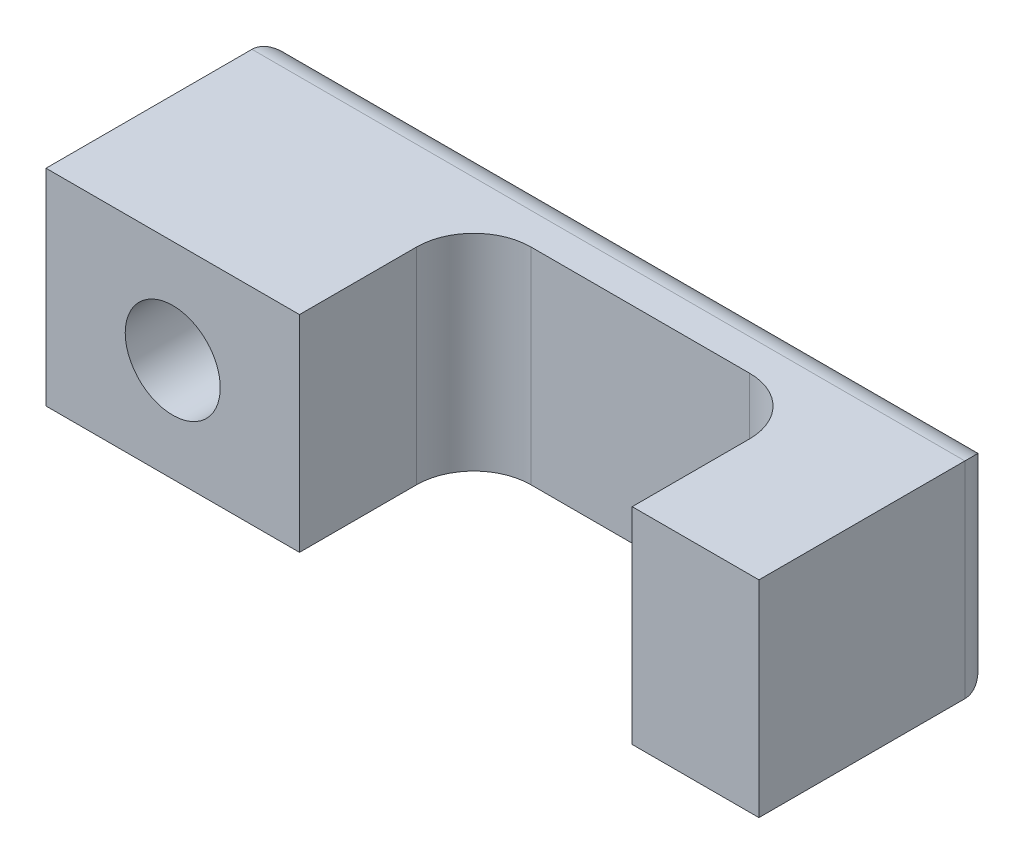
ISO-10303-21;
HEADER;
FILE_DESCRIPTION(('STEP AP214'),'2;1');
FILE_NAME('part.step','',(''),(''),'','','');
FILE_SCHEMA(('AUTOMOTIVE_DESIGN { 1 0 10303 214 1 1 1 1 }'));
ENDSEC;
DATA;
#1=APPLICATION_CONTEXT('core data for automotive mechanical design processes');
#2=APPLICATION_PROTOCOL_DEFINITION('international standard','automotive_design',2000,#1);
#3=PRODUCT_CONTEXT('',#1,'mechanical');
#4=PRODUCT('Part','Part','',(#3));
#5=PRODUCT_RELATED_PRODUCT_CATEGORY('part','',(#4));
#6=PRODUCT_DEFINITION_FORMATION('','',#4);
#7=PRODUCT_DEFINITION_CONTEXT('part definition',#1,'design');
#8=PRODUCT_DEFINITION('design','',#6,#7);
#9=PRODUCT_DEFINITION_SHAPE('','',#8);
#10=(LENGTH_UNIT() NAMED_UNIT(*) SI_UNIT(.MILLI.,.METRE.));
#11=(NAMED_UNIT(*) PLANE_ANGLE_UNIT() SI_UNIT($,.RADIAN.));
#12=(NAMED_UNIT(*) SI_UNIT($,.STERADIAN.) SOLID_ANGLE_UNIT());
#13=UNCERTAINTY_MEASURE_WITH_UNIT(LENGTH_MEASURE(1.E-05),#10,'distance_accuracy_value','');
#14=(GEOMETRIC_REPRESENTATION_CONTEXT(3) GLOBAL_UNCERTAINTY_ASSIGNED_CONTEXT((#13)) GLOBAL_UNIT_ASSIGNED_CONTEXT((#10,
#11,#12)) REPRESENTATION_CONTEXT('',''));
#15=CARTESIAN_POINT('',(0.,0.,0.));
#16=DIRECTION('',(0.,0.,1.));
#17=DIRECTION('',(1.,0.,0.));
#18=AXIS2_PLACEMENT_3D('',#15,#16,#17);
#19=CARTESIAN_POINT('',(0.,6.5,0.));
#20=DIRECTION('',(0.,0.,-1.));
#21=DIRECTION('',(-1.,0.,0.));
#22=AXIS2_PLACEMENT_3D('',#19,#20,#21);
#23=PLANE('',#22);
#24=CARTESIAN_POINT('',(4.,3.25,0.));
#25=DIRECTION('',(0.,0.,-1.));
#26=DIRECTION('',(-1.,0.,0.));
#27=AXIS2_PLACEMENT_3D('',#24,#25,#26);
#28=CIRCLE('',#27,1.5);
#29=CARTESIAN_POINT('',(2.5,3.25,0.));
#30=VERTEX_POINT('',#29);
#31=EDGE_CURVE('E161',#30,#30,#28,.T.);
#32=ORIENTED_EDGE('',*,*,#31,.T.);
#33=EDGE_LOOP('',(#32));
#34=FACE_BOUND('',#33,.T.);
#35=DIRECTION('',(0.,-1.,0.));
#36=VECTOR('',#35,1.);
#37=CARTESIAN_POINT('',(8.,6.5,0.));
#38=LINE('',#37,#36);
#39=CARTESIAN_POINT('',(8.,6.5,0.));
#40=VERTEX_POINT('',#39);
#41=CARTESIAN_POINT('',(8.,0.,0.));
#42=VERTEX_POINT('',#41);
#43=EDGE_CURVE('E128',#40,#42,#38,.T.);
#44=ORIENTED_EDGE('',*,*,#43,.F.);
#45=DIRECTION('',(1.,0.,0.));
#46=VECTOR('',#45,1.);
#47=CARTESIAN_POINT('',(0.,6.5,0.));
#48=LINE('',#47,#46);
#49=CARTESIAN_POINT('',(0.,6.5,0.));
#50=VERTEX_POINT('',#49);
#51=EDGE_CURVE('E141',#50,#40,#48,.T.);
#52=ORIENTED_EDGE('',*,*,#51,.F.);
#53=DIRECTION('',(0.,-1.,0.));
#54=VECTOR('',#53,1.);
#55=CARTESIAN_POINT('',(0.,6.5,0.));
#56=LINE('',#55,#54);
#57=CARTESIAN_POINT('',(0.,0.,0.));
#58=VERTEX_POINT('',#57);
#59=EDGE_CURVE('E168',#50,#58,#56,.T.);
#60=ORIENTED_EDGE('',*,*,#59,.T.);
#61=DIRECTION('',(1.,0.,0.));
#62=VECTOR('',#61,1.);
#63=CARTESIAN_POINT('',(0.,0.,0.));
#64=LINE('',#63,#62);
#65=EDGE_CURVE('E144',#58,#42,#64,.T.);
#66=ORIENTED_EDGE('',*,*,#65,.T.);
#67=EDGE_LOOP('',(#44,#52,#60,#66));
#68=FACE_BOUND('',#67,.T.);
#69=ADVANCED_FACE('F35',(#34,#68),#23,.F.);
#70=DIRECTION('',(0.,-1.,0.));
#71=VECTOR('',#70,1.);
#72=CARTESIAN_POINT('',(18.5,6.5,0.));
#73=LINE('',#72,#71);
#74=CARTESIAN_POINT('',(18.5,6.5,0.));
#75=VERTEX_POINT('',#74);
#76=CARTESIAN_POINT('',(18.5,0.,0.));
#77=VERTEX_POINT('',#76);
#78=EDGE_CURVE('E146',#75,#77,#73,.T.);
#79=ORIENTED_EDGE('',*,*,#78,.T.);
#80=CARTESIAN_POINT('',(22.5,0.,0.));
#81=VERTEX_POINT('',#80);
#82=EDGE_CURVE('E160',#77,#81,#64,.T.);
#83=ORIENTED_EDGE('',*,*,#82,.T.);
#84=DIRECTION('',(0.,-1.,0.));
#85=VECTOR('',#84,1.);
#86=CARTESIAN_POINT('',(22.5,6.5,0.));
#87=LINE('',#86,#85);
#88=CARTESIAN_POINT('',(22.5,6.5,0.));
#89=VERTEX_POINT('',#88);
#90=EDGE_CURVE('E153',#89,#81,#87,.T.);
#91=ORIENTED_EDGE('',*,*,#90,.F.);
#92=EDGE_CURVE('E151',#75,#89,#48,.T.);
#93=ORIENTED_EDGE('',*,*,#92,.F.);
#94=EDGE_LOOP('',(#79,#83,#91,#93));
#95=FACE_BOUND('',#94,.T.);
#96=ADVANCED_FACE('F246',(#95),#23,.F.);
#97=CARTESIAN_POINT('',(0.,6.5,0.));
#98=DIRECTION('',(0.,-1.,0.));
#99=DIRECTION('',(0.,0.,-1.));
#100=AXIS2_PLACEMENT_3D('',#97,#98,#99);
#101=PLANE('',#100);
#102=DIRECTION('',(0.,0.,-1.));
#103=VECTOR('',#102,1.);
#104=CARTESIAN_POINT('',(22.5,6.5,0.));
#105=LINE('',#104,#103);
#106=CARTESIAN_POINT('',(22.5,6.5,-6.5));
#107=VERTEX_POINT('',#106);
#108=EDGE_CURVE('E150',#89,#107,#105,.T.);
#109=ORIENTED_EDGE('',*,*,#108,.T.);
#110=DIRECTION('',(-1.,0.,0.));
#111=VECTOR('',#110,1.);
#112=CARTESIAN_POINT('',(0.,6.5,-6.5));
#113=LINE('',#112,#111);
#114=CARTESIAN_POINT('',(0.,6.5,-6.5));
#115=VERTEX_POINT('',#114);
#116=EDGE_CURVE('E58',#107,#115,#113,.T.);
#117=ORIENTED_EDGE('',*,*,#116,.T.);
#118=DIRECTION('',(0.,0.,1.));
#119=VECTOR('',#118,1.);
#120=CARTESIAN_POINT('',(0.,6.5,0.));
#121=LINE('',#120,#119);
#122=EDGE_CURVE('E149',#115,#50,#121,.T.);
#123=ORIENTED_EDGE('',*,*,#122,.T.);
#124=ORIENTED_EDGE('',*,*,#51,.T.);
#125=DIRECTION('',(0.,0.,1.));
#126=VECTOR('',#125,1.);
#127=CARTESIAN_POINT('',(8.,6.5,-3.7));
#128=LINE('',#127,#126);
#129=CARTESIAN_POINT('',(8.,6.5,-3.7));
#130=VERTEX_POINT('',#129);
#131=EDGE_CURVE('E125',#130,#40,#128,.T.);
#132=ORIENTED_EDGE('',*,*,#131,.F.);
#133=CARTESIAN_POINT('',(9.8,6.5,-3.7));
#134=DIRECTION('',(0.,1.,0.));
#135=DIRECTION('',(0.,0.,-1.));
#136=AXIS2_PLACEMENT_3D('',#133,#134,#135);
#137=CIRCLE('',#136,1.8);
#138=CARTESIAN_POINT('',(9.8,6.5,-5.5));
#139=VERTEX_POINT('',#138);
#140=EDGE_CURVE('E206',#139,#130,#137,.T.);
#141=ORIENTED_EDGE('',*,*,#140,.F.);
#142=DIRECTION('',(-1.,0.,0.));
#143=VECTOR('',#142,1.);
#144=CARTESIAN_POINT('',(16.7,6.5,-5.5));
#145=LINE('',#144,#143);
#146=CARTESIAN_POINT('',(16.7,6.5,-5.5));
#147=VERTEX_POINT('',#146);
#148=EDGE_CURVE('E301',#147,#139,#145,.T.);
#149=ORIENTED_EDGE('',*,*,#148,.F.);
#150=CARTESIAN_POINT('',(16.7,6.5,-3.7));
#151=DIRECTION('',(0.,1.,0.));
#152=DIRECTION('',(0.,0.,1.));
#153=AXIS2_PLACEMENT_3D('',#150,#151,#152);
#154=CIRCLE('',#153,1.8);
#155=CARTESIAN_POINT('',(18.5,6.5,-3.7));
#156=VERTEX_POINT('',#155);
#157=EDGE_CURVE('E296',#156,#147,#154,.T.);
#158=ORIENTED_EDGE('',*,*,#157,.F.);
#159=DIRECTION('',(0.,0.,-1.));
#160=VECTOR('',#159,1.);
#161=CARTESIAN_POINT('',(18.5,6.5,-3.7));
#162=LINE('',#161,#160);
#163=EDGE_CURVE('E134',#75,#156,#162,.T.);
#164=ORIENTED_EDGE('',*,*,#163,.F.);
#165=ORIENTED_EDGE('',*,*,#92,.T.);
#166=EDGE_LOOP('',(#109,#117,#123,#124,#132,#141,#149,#158,#164,#165));
#167=FACE_BOUND('',#166,.T.);
#168=ADVANCED_FACE('F148',(#167),#101,.F.);
#169=CARTESIAN_POINT('',(0.,0.,0.));
#170=DIRECTION('',(0.,-1.,0.));
#171=DIRECTION('',(0.,0.,-1.));
#172=AXIS2_PLACEMENT_3D('',#169,#170,#171);
#173=PLANE('',#172);
#174=DIRECTION('',(0.,0.,1.));
#175=VECTOR('',#174,1.);
#176=CARTESIAN_POINT('',(0.,0.,0.));
#177=LINE('',#176,#175);
#178=CARTESIAN_POINT('',(0.,0.,-6.5));
#179=VERTEX_POINT('',#178);
#180=EDGE_CURVE('E158',#179,#58,#177,.T.);
#181=ORIENTED_EDGE('',*,*,#180,.F.);
#182=DIRECTION('',(-1.,0.,0.));
#183=VECTOR('',#182,1.);
#184=CARTESIAN_POINT('',(22.5,0.,-6.5));
#185=LINE('',#184,#183);
#186=CARTESIAN_POINT('',(22.5,0.,-6.5));
#187=VERTEX_POINT('',#186);
#188=EDGE_CURVE('E44',#179,#187,#185,.F.);
#189=ORIENTED_EDGE('',*,*,#188,.T.);
#190=DIRECTION('',(0.,0.,-1.));
#191=VECTOR('',#190,1.);
#192=CARTESIAN_POINT('',(22.5,0.,0.));
#193=LINE('',#192,#191);
#194=EDGE_CURVE('E163',#81,#187,#193,.T.);
#195=ORIENTED_EDGE('',*,*,#194,.F.);
#196=ORIENTED_EDGE('',*,*,#82,.F.);
#197=DIRECTION('',(0.,0.,-1.));
#198=VECTOR('',#197,1.);
#199=CARTESIAN_POINT('',(18.5,0.,-3.7));
#200=LINE('',#199,#198);
#201=CARTESIAN_POINT('',(18.5,0.,-3.7));
#202=VERTEX_POINT('',#201);
#203=EDGE_CURVE('E198',#77,#202,#200,.T.);
#204=ORIENTED_EDGE('',*,*,#203,.T.);
#205=CARTESIAN_POINT('',(16.7,0.,-3.7));
#206=DIRECTION('',(0.,1.,0.));
#207=DIRECTION('',(0.,0.,1.));
#208=AXIS2_PLACEMENT_3D('',#205,#206,#207);
#209=CIRCLE('',#208,1.8);
#210=CARTESIAN_POINT('',(16.7,0.,-5.5));
#211=VERTEX_POINT('',#210);
#212=EDGE_CURVE('E203',#202,#211,#209,.T.);
#213=ORIENTED_EDGE('',*,*,#212,.T.);
#214=DIRECTION('',(-1.,0.,0.));
#215=VECTOR('',#214,1.);
#216=CARTESIAN_POINT('',(16.7,0.,-5.5));
#217=LINE('',#216,#215);
#218=CARTESIAN_POINT('',(9.8,0.,-5.5));
#219=VERTEX_POINT('',#218);
#220=EDGE_CURVE('E211',#211,#219,#217,.T.);
#221=ORIENTED_EDGE('',*,*,#220,.T.);
#222=CARTESIAN_POINT('',(9.8,0.,-3.7));
#223=DIRECTION('',(0.,1.,0.));
#224=DIRECTION('',(0.,0.,-1.));
#225=AXIS2_PLACEMENT_3D('',#222,#223,#224);
#226=CIRCLE('',#225,1.8);
#227=CARTESIAN_POINT('',(8.,0.,-3.7));
#228=VERTEX_POINT('',#227);
#229=EDGE_CURVE('E135',#219,#228,#226,.T.);
#230=ORIENTED_EDGE('',*,*,#229,.T.);
#231=DIRECTION('',(0.,0.,1.));
#232=VECTOR('',#231,1.);
#233=CARTESIAN_POINT('',(8.,0.,-3.7));
#234=LINE('',#233,#232);
#235=EDGE_CURVE('E194',#228,#42,#234,.T.);
#236=ORIENTED_EDGE('',*,*,#235,.T.);
#237=ORIENTED_EDGE('',*,*,#65,.F.);
#238=EDGE_LOOP('',(#181,#189,#195,#196,#204,#213,#221,#230,#236,#237));
#239=FACE_BOUND('',#238,.T.);
#240=ADVANCED_FACE('F256',(#239),#173,.T.);
#241=CARTESIAN_POINT('',(0.,6.5,0.));
#242=DIRECTION('',(1.,0.,0.));
#243=DIRECTION('',(0.,0.,-1.));
#244=AXIS2_PLACEMENT_3D('',#241,#242,#243);
#245=PLANE('',#244);
#246=ORIENTED_EDGE('',*,*,#122,.F.);
#247=DIRECTION('',(0.,-1.,0.));
#248=VECTOR('',#247,1.);
#249=CARTESIAN_POINT('',(0.,6.5,-6.5));
#250=LINE('',#249,#248);
#251=EDGE_CURVE('E11',#115,#179,#250,.T.);
#252=ORIENTED_EDGE('',*,*,#251,.T.);
#253=ORIENTED_EDGE('',*,*,#180,.T.);
#254=ORIENTED_EDGE('',*,*,#59,.F.);
#255=EDGE_LOOP('',(#246,#252,#253,#254));
#256=FACE_BOUND('',#255,.T.);
#257=ADVANCED_FACE('F241',(#256),#245,.F.);
#258=CARTESIAN_POINT('',(22.5,6.5,0.));
#259=DIRECTION('',(-1.,0.,0.));
#260=DIRECTION('',(0.,0.,1.));
#261=AXIS2_PLACEMENT_3D('',#258,#259,#260);
#262=PLANE('',#261);
#263=ORIENTED_EDGE('',*,*,#194,.T.);
#264=DIRECTION('',(0.,-1.,0.));
#265=VECTOR('',#264,1.);
#266=CARTESIAN_POINT('',(22.5,6.5,-6.5));
#267=LINE('',#266,#265);
#268=EDGE_CURVE('E179',#187,#107,#267,.F.);
#269=ORIENTED_EDGE('',*,*,#268,.T.);
#270=ORIENTED_EDGE('',*,*,#108,.F.);
#271=ORIENTED_EDGE('',*,*,#90,.T.);
#272=EDGE_LOOP('',(#263,#269,#270,#271));
#273=FACE_BOUND('',#272,.T.);
#274=ADVANCED_FACE('F232',(#273),#262,.F.);
#275=CARTESIAN_POINT('',(0.,6.5,-7.5));
#276=DIRECTION('',(0.,0.,1.));
#277=DIRECTION('',(1.,0.,0.));
#278=AXIS2_PLACEMENT_3D('',#275,#276,#277);
#279=PLANE('',#278);
#280=DIRECTION('',(-1.,0.,0.));
#281=VECTOR('',#280,1.);
#282=CARTESIAN_POINT('',(0.,5.5,-7.5));
#283=LINE('',#282,#281);
#284=CARTESIAN_POINT('',(1.,5.5,-7.5));
#285=VERTEX_POINT('',#284);
#286=CARTESIAN_POINT('',(21.5,5.5,-7.5));
#287=VERTEX_POINT('',#286);
#288=EDGE_CURVE('E174',#285,#287,#283,.F.);
#289=ORIENTED_EDGE('',*,*,#288,.T.);
#290=DIRECTION('',(0.,-1.,0.));
#291=VECTOR('',#290,1.);
#292=CARTESIAN_POINT('',(21.5,6.5,-7.5));
#293=LINE('',#292,#291);
#294=CARTESIAN_POINT('',(21.5,1.,-7.5));
#295=VERTEX_POINT('',#294);
#296=EDGE_CURVE('E176',#287,#295,#293,.T.);
#297=ORIENTED_EDGE('',*,*,#296,.T.);
#298=DIRECTION('',(-1.,0.,0.));
#299=VECTOR('',#298,1.);
#300=CARTESIAN_POINT('',(0.,1.,-7.5));
#301=LINE('',#300,#299);
#302=CARTESIAN_POINT('',(1.,1.,-7.5));
#303=VERTEX_POINT('',#302);
#304=EDGE_CURVE('E172',#295,#303,#301,.T.);
#305=ORIENTED_EDGE('',*,*,#304,.T.);
#306=DIRECTION('',(0.,-1.,0.));
#307=VECTOR('',#306,1.);
#308=CARTESIAN_POINT('',(1.,6.5,-7.5));
#309=LINE('',#308,#307);
#310=EDGE_CURVE('E170',#303,#285,#309,.F.);
#311=ORIENTED_EDGE('',*,*,#310,.T.);
#312=EDGE_LOOP('',(#289,#297,#305,#311));
#313=FACE_BOUND('',#312,.T.);
#314=CARTESIAN_POINT('',(4.,3.25,-7.5));
#315=DIRECTION('',(0.,0.,-1.));
#316=DIRECTION('',(-1.,0.,0.));
#317=AXIS2_PLACEMENT_3D('',#314,#315,#316);
#318=CIRCLE('',#317,1.5);
#319=CARTESIAN_POINT('',(2.5,3.25,-7.5));
#320=VERTEX_POINT('',#319);
#321=EDGE_CURVE('E145',#320,#320,#318,.T.);
#322=ORIENTED_EDGE('',*,*,#321,.F.);
#323=EDGE_LOOP('',(#322));
#324=FACE_BOUND('',#323,.T.);
#325=ADVANCED_FACE('F230',(#313,#324),#279,.F.);
#326=CARTESIAN_POINT('',(4.,3.25,0.));
#327=DIRECTION('',(0.,0.,-1.));
#328=DIRECTION('',(-1.,0.,0.));
#329=AXIS2_PLACEMENT_3D('',#326,#327,#328);
#330=CYLINDRICAL_SURFACE('',#329,1.5);
#331=ORIENTED_EDGE('',*,*,#31,.F.);
#332=EDGE_LOOP('',(#331));
#333=FACE_BOUND('',#332,.T.);
#334=ORIENTED_EDGE('',*,*,#321,.T.);
#335=EDGE_LOOP('',(#334));
#336=FACE_BOUND('',#335,.T.);
#337=ADVANCED_FACE('F228',(#333,#336),#330,.F.);
#338=CARTESIAN_POINT('',(8.,6.5,-3.7));
#339=DIRECTION('',(1.,0.,0.));
#340=DIRECTION('',(0.,0.,-1.));
#341=AXIS2_PLACEMENT_3D('',#338,#339,#340);
#342=PLANE('',#341);
#343=ORIENTED_EDGE('',*,*,#235,.F.);
#344=DIRECTION('',(0.,-1.,0.));
#345=VECTOR('',#344,1.);
#346=CARTESIAN_POINT('',(8.,6.5,-3.7));
#347=LINE('',#346,#345);
#348=EDGE_CURVE('E131',#130,#228,#347,.T.);
#349=ORIENTED_EDGE('',*,*,#348,.F.);
#350=ORIENTED_EDGE('',*,*,#131,.T.);
#351=ORIENTED_EDGE('',*,*,#43,.T.);
#352=EDGE_LOOP('',(#343,#349,#350,#351));
#353=FACE_BOUND('',#352,.T.);
#354=ADVANCED_FACE('F127',(#353),#342,.T.);
#355=CARTESIAN_POINT('',(18.5,6.5,-3.7));
#356=DIRECTION('',(-1.,0.,0.));
#357=DIRECTION('',(0.,0.,1.));
#358=AXIS2_PLACEMENT_3D('',#355,#356,#357);
#359=PLANE('',#358);
#360=ORIENTED_EDGE('',*,*,#203,.F.);
#361=ORIENTED_EDGE('',*,*,#78,.F.);
#362=ORIENTED_EDGE('',*,*,#163,.T.);
#363=DIRECTION('',(0.,-1.,0.));
#364=VECTOR('',#363,1.);
#365=CARTESIAN_POINT('',(18.5,6.5,-3.7));
#366=LINE('',#365,#364);
#367=EDGE_CURVE('E220',#156,#202,#366,.T.);
#368=ORIENTED_EDGE('',*,*,#367,.T.);
#369=EDGE_LOOP('',(#360,#361,#362,#368));
#370=FACE_BOUND('',#369,.T.);
#371=ADVANCED_FACE('F288',(#370),#359,.T.);
#372=CARTESIAN_POINT('',(16.7,6.5,-3.7));
#373=DIRECTION('',(0.,-1.,0.));
#374=DIRECTION('',(0.,0.,-1.));
#375=AXIS2_PLACEMENT_3D('',#372,#373,#374);
#376=CYLINDRICAL_SURFACE('',#375,1.8);
#377=ORIENTED_EDGE('',*,*,#212,.F.);
#378=ORIENTED_EDGE('',*,*,#367,.F.);
#379=ORIENTED_EDGE('',*,*,#157,.T.);
#380=DIRECTION('',(0.,-1.,0.));
#381=VECTOR('',#380,1.);
#382=CARTESIAN_POINT('',(16.7,6.5,-5.5));
#383=LINE('',#382,#381);
#384=EDGE_CURVE('E218',#147,#211,#383,.T.);
#385=ORIENTED_EDGE('',*,*,#384,.T.);
#386=EDGE_LOOP('',(#377,#378,#379,#385));
#387=FACE_BOUND('',#386,.T.);
#388=ADVANCED_FACE('F293',(#387),#376,.F.);
#389=CARTESIAN_POINT('',(16.7,6.5,-5.5));
#390=DIRECTION('',(0.,0.,1.));
#391=DIRECTION('',(1.,0.,0.));
#392=AXIS2_PLACEMENT_3D('',#389,#390,#391);
#393=PLANE('',#392);
#394=ORIENTED_EDGE('',*,*,#220,.F.);
#395=ORIENTED_EDGE('',*,*,#384,.F.);
#396=ORIENTED_EDGE('',*,*,#148,.T.);
#397=DIRECTION('',(0.,-1.,0.));
#398=VECTOR('',#397,1.);
#399=CARTESIAN_POINT('',(9.8,6.5,-5.5));
#400=LINE('',#399,#398);
#401=EDGE_CURVE('E216',#139,#219,#400,.T.);
#402=ORIENTED_EDGE('',*,*,#401,.T.);
#403=EDGE_LOOP('',(#394,#395,#396,#402));
#404=FACE_BOUND('',#403,.T.);
#405=ADVANCED_FACE('F273',(#404),#393,.T.);
#406=CARTESIAN_POINT('',(9.8,6.5,-3.7));
#407=DIRECTION('',(0.,-1.,0.));
#408=DIRECTION('',(0.,0.,-1.));
#409=AXIS2_PLACEMENT_3D('',#406,#407,#408);
#410=CYLINDRICAL_SURFACE('',#409,1.8);
#411=ORIENTED_EDGE('',*,*,#229,.F.);
#412=ORIENTED_EDGE('',*,*,#401,.F.);
#413=ORIENTED_EDGE('',*,*,#140,.T.);
#414=ORIENTED_EDGE('',*,*,#348,.T.);
#415=EDGE_LOOP('',(#411,#412,#413,#414));
#416=FACE_BOUND('',#415,.T.);
#417=ADVANCED_FACE('F268',(#416),#410,.F.);
#418=CARTESIAN_POINT('',(1.,6.5,-6.5));
#419=DIRECTION('',(0.,-1.,0.));
#420=DIRECTION('',(0.,0.,-1.));
#421=AXIS2_PLACEMENT_3D('',#418,#419,#420);
#422=CYLINDRICAL_SURFACE('',#421,1.);
#423=CARTESIAN_POINT('',(1.,1.,-6.5));
#424=DIRECTION('',(0.707106781186547,-0.707106781186547,0.));
#425=DIRECTION('',(-0.707106781186547,-0.707106781186547,0.));
#426=AXIS2_PLACEMENT_3D('',#423,#424,#425);
#427=ELLIPSE('',#426,1.41421356237309,1.);
#428=EDGE_CURVE('E187',#179,#303,#427,.T.);
#429=ORIENTED_EDGE('',*,*,#428,.F.);
#430=ORIENTED_EDGE('',*,*,#251,.F.);
#431=CARTESIAN_POINT('',(1.,5.5,-6.5));
#432=DIRECTION('',(-0.707106781186547,-0.707106781186547,0.));
#433=DIRECTION('',(0.707106781186547,-0.707106781186547,0.));
#434=AXIS2_PLACEMENT_3D('',#431,#432,#433);
#435=ELLIPSE('',#434,1.41421356237309,1.);
#436=EDGE_CURVE('E39',#285,#115,#435,.F.);
#437=ORIENTED_EDGE('',*,*,#436,.F.);
#438=ORIENTED_EDGE('',*,*,#310,.F.);
#439=EDGE_LOOP('',(#429,#430,#437,#438));
#440=FACE_BOUND('',#439,.T.);
#441=ADVANCED_FACE('F37',(#440),#422,.T.);
#442=CARTESIAN_POINT('',(0.,5.5,-6.5));
#443=DIRECTION('',(-1.,0.,0.));
#444=DIRECTION('',(0.,0.,1.));
#445=AXIS2_PLACEMENT_3D('',#442,#443,#444);
#446=CYLINDRICAL_SURFACE('',#445,1.);
#447=ORIENTED_EDGE('',*,*,#436,.T.);
#448=ORIENTED_EDGE('',*,*,#116,.F.);
#449=CARTESIAN_POINT('',(21.5,5.5,-6.5));
#450=DIRECTION('',(-0.707106781186547,0.707106781186547,0.));
#451=DIRECTION('',(-0.707106781186547,-0.707106781186547,0.));
#452=AXIS2_PLACEMENT_3D('',#449,#450,#451);
#453=ELLIPSE('',#452,1.41421356237309,1.);
#454=EDGE_CURVE('E186',#287,#107,#453,.F.);
#455=ORIENTED_EDGE('',*,*,#454,.F.);
#456=ORIENTED_EDGE('',*,*,#288,.F.);
#457=EDGE_LOOP('',(#447,#448,#455,#456));
#458=FACE_BOUND('',#457,.T.);
#459=ADVANCED_FACE('F263',(#458),#446,.T.);
#460=CARTESIAN_POINT('',(0.,1.,-6.5));
#461=DIRECTION('',(1.,0.,0.));
#462=DIRECTION('',(0.,0.,-1.));
#463=AXIS2_PLACEMENT_3D('',#460,#461,#462);
#464=CYLINDRICAL_SURFACE('',#463,1.);
#465=ORIENTED_EDGE('',*,*,#428,.T.);
#466=ORIENTED_EDGE('',*,*,#304,.F.);
#467=CARTESIAN_POINT('',(21.5,1.,-6.5));
#468=DIRECTION('',(0.707106781186547,0.707106781186547,0.));
#469=DIRECTION('',(0.707106781186547,-0.707106781186547,0.));
#470=AXIS2_PLACEMENT_3D('',#467,#468,#469);
#471=ELLIPSE('',#470,1.41421356237309,1.);
#472=EDGE_CURVE('E184',#187,#295,#471,.T.);
#473=ORIENTED_EDGE('',*,*,#472,.F.);
#474=ORIENTED_EDGE('',*,*,#188,.F.);
#475=EDGE_LOOP('',(#465,#466,#473,#474));
#476=FACE_BOUND('',#475,.T.);
#477=ADVANCED_FACE('F260',(#476),#464,.T.);
#478=CARTESIAN_POINT('',(21.5,6.5,-6.5));
#479=DIRECTION('',(0.,-1.,0.));
#480=DIRECTION('',(0.,0.,-1.));
#481=AXIS2_PLACEMENT_3D('',#478,#479,#480);
#482=CYLINDRICAL_SURFACE('',#481,1.);
#483=ORIENTED_EDGE('',*,*,#454,.T.);
#484=ORIENTED_EDGE('',*,*,#268,.F.);
#485=ORIENTED_EDGE('',*,*,#472,.T.);
#486=ORIENTED_EDGE('',*,*,#296,.F.);
#487=EDGE_LOOP('',(#483,#484,#485,#486));
#488=FACE_BOUND('',#487,.T.);
#489=ADVANCED_FACE('F257',(#488),#482,.T.);
#490=CLOSED_SHELL('',(#69,#96,#168,#240,#257,#274,#325,#337,#354,#371,#388,#405,#417,#441,#459,
#477,#489));
#491=MANIFOLD_SOLID_BREP('B2',#490);
#492=ADVANCED_BREP_SHAPE_REPRESENTATION('',(#18,#491),#14);
#493=SHAPE_DEFINITION_REPRESENTATION(#9,#492);
ENDSEC;
END-ISO-10303-21;
